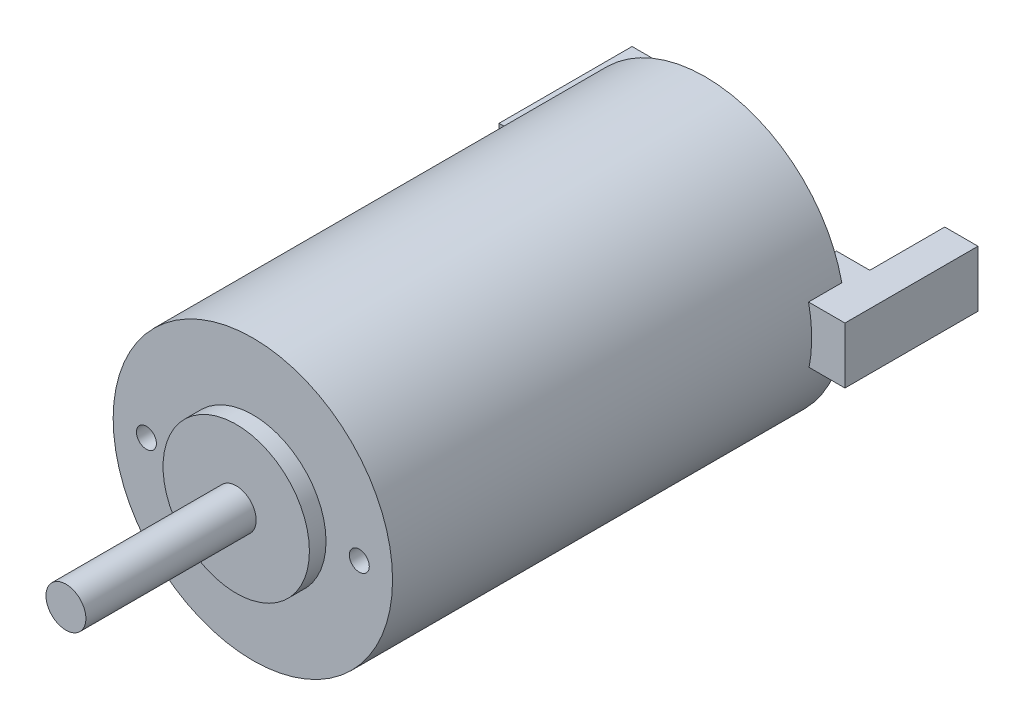
ISO-10303-21;
HEADER;
FILE_DESCRIPTION(('STEP AP214'),'2;1');
FILE_NAME('part.step','',(''),(''),'','','');
FILE_SCHEMA(('AUTOMOTIVE_DESIGN { 1 0 10303 214 1 1 1 1 }'));
ENDSEC;
DATA;
#1=APPLICATION_CONTEXT('core data for automotive mechanical design processes');
#2=APPLICATION_PROTOCOL_DEFINITION('international standard','automotive_design',2000,#1);
#3=PRODUCT_CONTEXT('',#1,'mechanical');
#4=PRODUCT('Part','Part','',(#3));
#5=PRODUCT_RELATED_PRODUCT_CATEGORY('part','',(#4));
#6=PRODUCT_DEFINITION_FORMATION('','',#4);
#7=PRODUCT_DEFINITION_CONTEXT('part definition',#1,'design');
#8=PRODUCT_DEFINITION('design','',#6,#7);
#9=PRODUCT_DEFINITION_SHAPE('','',#8);
#10=(LENGTH_UNIT() NAMED_UNIT(*) SI_UNIT(.MILLI.,.METRE.));
#11=(NAMED_UNIT(*) PLANE_ANGLE_UNIT() SI_UNIT($,.RADIAN.));
#12=(NAMED_UNIT(*) SI_UNIT($,.STERADIAN.) SOLID_ANGLE_UNIT());
#13=UNCERTAINTY_MEASURE_WITH_UNIT(LENGTH_MEASURE(1.E-05),#10,'distance_accuracy_value','');
#14=(GEOMETRIC_REPRESENTATION_CONTEXT(3) GLOBAL_UNCERTAINTY_ASSIGNED_CONTEXT((#13)) GLOBAL_UNIT_ASSIGNED_CONTEXT((#10,
#11,#12)) REPRESENTATION_CONTEXT('',''));
#15=CARTESIAN_POINT('',(0.,0.,0.));
#16=DIRECTION('',(0.,0.,1.));
#17=DIRECTION('',(1.,0.,0.));
#18=AXIS2_PLACEMENT_3D('',#15,#16,#17);
#19=CARTESIAN_POINT('',(0.,0.,68.));
#20=DIRECTION('',(0.,0.,-1.));
#21=DIRECTION('',(-1.,0.,0.));
#22=AXIS2_PLACEMENT_3D('',#19,#20,#21);
#23=CYLINDRICAL_SURFACE('',#22,21.);
#24=CARTESIAN_POINT('',(0.,0.,68.));
#25=DIRECTION('',(0.,0.,1.));
#26=DIRECTION('',(1.,0.,0.));
#27=AXIS2_PLACEMENT_3D('',#24,#25,#26);
#28=CIRCLE('',#27,21.);
#29=CARTESIAN_POINT('',(21.,0.,68.));
#30=VERTEX_POINT('',#29);
#31=EDGE_CURVE('E302',#30,#30,#28,.T.);
#32=ORIENTED_EDGE('',*,*,#31,.F.);
#33=EDGE_LOOP('',(#32));
#34=FACE_BOUND('',#33,.T.);
#35=DIRECTION('',(0.,0.,-1.));
#36=VECTOR('',#35,1.);
#37=CARTESIAN_POINT('',(-20.6096565623727,-4.03014346904024,68.));
#38=LINE('',#37,#36);
#39=CARTESIAN_POINT('',(-20.6096565623727,-4.03014346904024,0.));
#40=VERTEX_POINT('',#39);
#41=CARTESIAN_POINT('',(-20.6096565623727,-4.03014346904024,5.));
#42=VERTEX_POINT('',#41);
#43=EDGE_CURVE('E240',#40,#42,#38,.F.);
#44=ORIENTED_EDGE('',*,*,#43,.F.);
#45=CARTESIAN_POINT('',(0.,0.,0.));
#46=DIRECTION('',(0.,0.,1.));
#47=DIRECTION('',(1.,0.,0.));
#48=AXIS2_PLACEMENT_3D('',#45,#46,#47);
#49=CIRCLE('',#48,21.);
#50=CARTESIAN_POINT('',(20.6096565623727,-4.03014346904025,0.));
#51=VERTEX_POINT('',#50);
#52=EDGE_CURVE('E298',#40,#51,#49,.T.);
#53=ORIENTED_EDGE('',*,*,#52,.T.);
#54=DIRECTION('',(0.,0.,-1.));
#55=VECTOR('',#54,1.);
#56=CARTESIAN_POINT('',(20.6096565623727,-4.03014346904025,68.));
#57=LINE('',#56,#55);
#58=CARTESIAN_POINT('',(20.6096565623727,-4.03014346904025,5.));
#59=VERTEX_POINT('',#58);
#60=EDGE_CURVE('E277',#59,#51,#57,.T.);
#61=ORIENTED_EDGE('',*,*,#60,.F.);
#62=CARTESIAN_POINT('',(0.,0.,5.));
#63=DIRECTION('',(0.,0.,-1.));
#64=DIRECTION('',(-1.,0.,0.));
#65=AXIS2_PLACEMENT_3D('',#62,#63,#64);
#66=CIRCLE('',#65,21.);
#67=CARTESIAN_POINT('',(20.5258155301212,4.43744259945264,5.));
#68=VERTEX_POINT('',#67);
#69=EDGE_CURVE('E320',#68,#59,#66,.T.);
#70=ORIENTED_EDGE('',*,*,#69,.F.);
#71=DIRECTION('',(0.,0.,-1.));
#72=VECTOR('',#71,1.);
#73=CARTESIAN_POINT('',(20.5258155301212,4.43744259945264,68.));
#74=LINE('',#73,#72);
#75=CARTESIAN_POINT('',(20.5258155301212,4.43744259945264,0.));
#76=VERTEX_POINT('',#75);
#77=EDGE_CURVE('E281',#76,#68,#74,.F.);
#78=ORIENTED_EDGE('',*,*,#77,.F.);
#79=CARTESIAN_POINT('',(-20.5258155301212,4.43744259945264,0.));
#80=VERTEX_POINT('',#79);
#81=EDGE_CURVE('E306',#76,#80,#49,.T.);
#82=ORIENTED_EDGE('',*,*,#81,.T.);
#83=DIRECTION('',(0.,0.,-1.));
#84=VECTOR('',#83,1.);
#85=CARTESIAN_POINT('',(-20.5258155301212,4.43744259945264,68.));
#86=LINE('',#85,#84);
#87=CARTESIAN_POINT('',(-20.5258155301212,4.43744259945264,5.));
#88=VERTEX_POINT('',#87);
#89=EDGE_CURVE('E237',#88,#80,#86,.T.);
#90=ORIENTED_EDGE('',*,*,#89,.F.);
#91=CARTESIAN_POINT('',(0.,0.,5.));
#92=DIRECTION('',(0.,0.,-1.));
#93=DIRECTION('',(-1.,0.,0.));
#94=AXIS2_PLACEMENT_3D('',#91,#92,#93);
#95=CIRCLE('',#94,21.);
#96=EDGE_CURVE('E334',#42,#88,#95,.T.);
#97=ORIENTED_EDGE('',*,*,#96,.F.);
#98=EDGE_LOOP('',(#44,#53,#61,#70,#78,#82,#90,#97));
#99=FACE_BOUND('',#98,.T.);
#100=ADVANCED_FACE('F38',(#34,#99),#23,.T.);
#101=CARTESIAN_POINT('',(0.,0.,0.));
#102=DIRECTION('',(0.,0.,1.));
#103=DIRECTION('',(1.,0.,0.));
#104=AXIS2_PLACEMENT_3D('',#101,#102,#103);
#105=PLANE('',#104);
#106=DIRECTION('',(-1.,0.,0.));
#107=VECTOR('',#106,1.);
#108=CARTESIAN_POINT('',(0.,-4.03014346904024,0.));
#109=LINE('',#108,#107);
#110=CARTESIAN_POINT('',(-16.,-4.03014346904024,0.));
#111=VERTEX_POINT('',#110);
#112=EDGE_CURVE('E331',#111,#40,#109,.T.);
#113=ORIENTED_EDGE('',*,*,#112,.F.);
#114=DIRECTION('',(0.,1.,0.));
#115=VECTOR('',#114,1.);
#116=CARTESIAN_POINT('',(-16.,0.,0.));
#117=LINE('',#116,#115);
#118=CARTESIAN_POINT('',(-16.,4.43744259945264,0.));
#119=VERTEX_POINT('',#118);
#120=EDGE_CURVE('E323',#111,#119,#117,.T.);
#121=ORIENTED_EDGE('',*,*,#120,.T.);
#122=DIRECTION('',(1.,0.,0.));
#123=VECTOR('',#122,1.);
#124=CARTESIAN_POINT('',(0.,4.43744259945264,0.));
#125=LINE('',#124,#123);
#126=EDGE_CURVE('E327',#80,#119,#125,.T.);
#127=ORIENTED_EDGE('',*,*,#126,.F.);
#128=ORIENTED_EDGE('',*,*,#81,.F.);
#129=DIRECTION('',(1.,0.,0.));
#130=VECTOR('',#129,1.);
#131=CARTESIAN_POINT('',(0.,4.43744259945264,0.));
#132=LINE('',#131,#130);
#133=CARTESIAN_POINT('',(16.,4.43744259945264,0.));
#134=VERTEX_POINT('',#133);
#135=EDGE_CURVE('E317',#134,#76,#132,.T.);
#136=ORIENTED_EDGE('',*,*,#135,.F.);
#137=DIRECTION('',(0.,-1.,0.));
#138=VECTOR('',#137,1.);
#139=CARTESIAN_POINT('',(16.,0.,0.));
#140=LINE('',#139,#138);
#141=CARTESIAN_POINT('',(16.,-4.03014346904025,0.));
#142=VERTEX_POINT('',#141);
#143=EDGE_CURVE('E293',#134,#142,#140,.T.);
#144=ORIENTED_EDGE('',*,*,#143,.T.);
#145=DIRECTION('',(-1.,0.,0.));
#146=VECTOR('',#145,1.);
#147=CARTESIAN_POINT('',(0.,-4.03014346904025,0.));
#148=LINE('',#147,#146);
#149=EDGE_CURVE('E313',#51,#142,#148,.T.);
#150=ORIENTED_EDGE('',*,*,#149,.F.);
#151=ORIENTED_EDGE('',*,*,#52,.F.);
#152=EDGE_LOOP('',(#113,#121,#127,#128,#136,#144,#150,#151));
#153=FACE_BOUND('',#152,.T.);
#154=ADVANCED_FACE('F367',(#153),#105,.F.);
#155=CARTESIAN_POINT('',(0.,0.,68.));
#156=DIRECTION('',(0.,0.,1.));
#157=DIRECTION('',(1.,0.,0.));
#158=AXIS2_PLACEMENT_3D('',#155,#156,#157);
#159=PLANE('',#158);
#160=CARTESIAN_POINT('',(-16.,0.,68.));
#161=DIRECTION('',(0.,0.,1.));
#162=DIRECTION('',(1.,0.,0.));
#163=AXIS2_PLACEMENT_3D('',#160,#161,#162);
#164=CIRCLE('',#163,1.5);
#165=CARTESIAN_POINT('',(-14.5,0.,68.));
#166=VERTEX_POINT('',#165);
#167=EDGE_CURVE('E486',#166,#166,#164,.T.);
#168=ORIENTED_EDGE('',*,*,#167,.F.);
#169=EDGE_LOOP('',(#168));
#170=FACE_BOUND('',#169,.T.);
#171=CARTESIAN_POINT('',(16.,0.,68.));
#172=DIRECTION('',(0.,0.,1.));
#173=DIRECTION('',(1.,0.,0.));
#174=AXIS2_PLACEMENT_3D('',#171,#172,#173);
#175=CIRCLE('',#174,1.5);
#176=CARTESIAN_POINT('',(17.5,0.,68.));
#177=VERTEX_POINT('',#176);
#178=EDGE_CURVE('E495',#177,#177,#175,.T.);
#179=ORIENTED_EDGE('',*,*,#178,.F.);
#180=EDGE_LOOP('',(#179));
#181=FACE_BOUND('',#180,.T.);
#182=CARTESIAN_POINT('',(0.,0.,68.));
#183=DIRECTION('',(0.,0.,1.));
#184=DIRECTION('',(1.,0.,0.));
#185=AXIS2_PLACEMENT_3D('',#182,#183,#184);
#186=CIRCLE('',#185,11.);
#187=CARTESIAN_POINT('',(11.,0.,68.));
#188=VERTEX_POINT('',#187);
#189=EDGE_CURVE('E294',#188,#188,#186,.T.);
#190=ORIENTED_EDGE('',*,*,#189,.F.);
#191=EDGE_LOOP('',(#190));
#192=FACE_BOUND('',#191,.T.);
#193=ORIENTED_EDGE('',*,*,#31,.T.);
#194=EDGE_LOOP('',(#193));
#195=FACE_BOUND('',#194,.T.);
#196=ADVANCED_FACE('F393',(#170,#181,#192,#195),#159,.T.);
#197=CARTESIAN_POINT('',(0.,0.,70.5));
#198=DIRECTION('',(0.,0.,-1.));
#199=DIRECTION('',(-1.,0.,0.));
#200=AXIS2_PLACEMENT_3D('',#197,#198,#199);
#201=CYLINDRICAL_SURFACE('',#200,11.);
#202=CARTESIAN_POINT('',(0.,0.,70.5));
#203=DIRECTION('',(0.,0.,1.));
#204=DIRECTION('',(1.,0.,0.));
#205=AXIS2_PLACEMENT_3D('',#202,#203,#204);
#206=CIRCLE('',#205,11.);
#207=CARTESIAN_POINT('',(11.,0.,70.5));
#208=VERTEX_POINT('',#207);
#209=EDGE_CURVE('E288',#208,#208,#206,.T.);
#210=ORIENTED_EDGE('',*,*,#209,.F.);
#211=EDGE_LOOP('',(#210));
#212=FACE_BOUND('',#211,.T.);
#213=ORIENTED_EDGE('',*,*,#189,.T.);
#214=EDGE_LOOP('',(#213));
#215=FACE_BOUND('',#214,.T.);
#216=ADVANCED_FACE('F397',(#212,#215),#201,.T.);
#217=CARTESIAN_POINT('',(0.,0.,70.5));
#218=DIRECTION('',(0.,0.,1.));
#219=DIRECTION('',(1.,0.,0.));
#220=AXIS2_PLACEMENT_3D('',#217,#218,#219);
#221=PLANE('',#220);
#222=CARTESIAN_POINT('',(0.,0.,70.5));
#223=DIRECTION('',(0.,0.,1.));
#224=DIRECTION('',(1.,0.,0.));
#225=AXIS2_PLACEMENT_3D('',#222,#223,#224);
#226=CIRCLE('',#225,3.);
#227=CARTESIAN_POINT('',(3.,0.,70.5));
#228=VERTEX_POINT('',#227);
#229=EDGE_CURVE('E289',#228,#228,#226,.T.);
#230=ORIENTED_EDGE('',*,*,#229,.F.);
#231=EDGE_LOOP('',(#230));
#232=FACE_BOUND('',#231,.T.);
#233=ORIENTED_EDGE('',*,*,#209,.T.);
#234=EDGE_LOOP('',(#233));
#235=FACE_BOUND('',#234,.T.);
#236=ADVANCED_FACE('F405',(#232,#235),#221,.T.);
#237=CARTESIAN_POINT('',(0.,0.,96.1));
#238=DIRECTION('',(0.,0.,-1.));
#239=DIRECTION('',(-1.,0.,0.));
#240=AXIS2_PLACEMENT_3D('',#237,#238,#239);
#241=CYLINDRICAL_SURFACE('',#240,3.);
#242=CARTESIAN_POINT('',(0.,0.,96.1));
#243=DIRECTION('',(0.,0.,1.));
#244=DIRECTION('',(1.,0.,0.));
#245=AXIS2_PLACEMENT_3D('',#242,#243,#244);
#246=CIRCLE('',#245,3.);
#247=CARTESIAN_POINT('',(3.,0.,96.1));
#248=VERTEX_POINT('',#247);
#249=EDGE_CURVE('E284',#248,#248,#246,.T.);
#250=ORIENTED_EDGE('',*,*,#249,.F.);
#251=EDGE_LOOP('',(#250));
#252=FACE_BOUND('',#251,.T.);
#253=ORIENTED_EDGE('',*,*,#229,.T.);
#254=EDGE_LOOP('',(#253));
#255=FACE_BOUND('',#254,.T.);
#256=ADVANCED_FACE('F413',(#252,#255),#241,.T.);
#257=CARTESIAN_POINT('',(0.,0.,96.1));
#258=DIRECTION('',(0.,0.,1.));
#259=DIRECTION('',(1.,0.,0.));
#260=AXIS2_PLACEMENT_3D('',#257,#258,#259);
#261=PLANE('',#260);
#262=ORIENTED_EDGE('',*,*,#249,.T.);
#263=EDGE_LOOP('',(#262));
#264=FACE_BOUND('',#263,.T.);
#265=ADVANCED_FACE('F417',(#264),#261,.T.);
#266=CARTESIAN_POINT('',(26.,4.43744259945264,5.));
#267=DIRECTION('',(0.,-1.,0.));
#268=DIRECTION('',(0.,0.,-1.));
#269=AXIS2_PLACEMENT_3D('',#266,#267,#268);
#270=PLANE('',#269);
#271=DIRECTION('',(-1.,0.,0.));
#272=VECTOR('',#271,1.);
#273=CARTESIAN_POINT('',(26.,4.43744259945264,-15.));
#274=LINE('',#273,#272);
#275=CARTESIAN_POINT('',(26.,4.43744259945264,-15.));
#276=VERTEX_POINT('',#275);
#277=CARTESIAN_POINT('',(21.,4.43744259945264,-15.));
#278=VERTEX_POINT('',#277);
#279=EDGE_CURVE('E175',#276,#278,#274,.T.);
#280=ORIENTED_EDGE('',*,*,#279,.T.);
#281=DIRECTION('',(0.,0.,-1.));
#282=VECTOR('',#281,1.);
#283=CARTESIAN_POINT('',(21.,4.43744259945264,-3.73500225310474));
#284=LINE('',#283,#282);
#285=CARTESIAN_POINT('',(21.,4.43744259945264,-3.73500225310474));
#286=VERTEX_POINT('',#285);
#287=EDGE_CURVE('E53',#286,#278,#284,.T.);
#288=ORIENTED_EDGE('',*,*,#287,.F.);
#289=DIRECTION('',(1.,0.,0.));
#290=VECTOR('',#289,1.);
#291=CARTESIAN_POINT('',(16.,4.43744259945264,-3.73500225310474));
#292=LINE('',#291,#290);
#293=CARTESIAN_POINT('',(16.,4.43744259945264,-3.73500225310474));
#294=VERTEX_POINT('',#293);
#295=EDGE_CURVE('E161',#294,#286,#292,.T.);
#296=ORIENTED_EDGE('',*,*,#295,.F.);
#297=DIRECTION('',(0.,0.,1.));
#298=VECTOR('',#297,1.);
#299=CARTESIAN_POINT('',(16.,4.43744259945264,5.));
#300=LINE('',#299,#298);
#301=EDGE_CURVE('E243',#294,#134,#300,.T.);
#302=ORIENTED_EDGE('',*,*,#301,.T.);
#303=ORIENTED_EDGE('',*,*,#135,.T.);
#304=ORIENTED_EDGE('',*,*,#77,.T.);
#305=DIRECTION('',(-1.,0.,0.));
#306=VECTOR('',#305,1.);
#307=CARTESIAN_POINT('',(26.,4.43744259945264,5.));
#308=LINE('',#307,#306);
#309=CARTESIAN_POINT('',(26.,4.43744259945264,5.));
#310=VERTEX_POINT('',#309);
#311=EDGE_CURVE('E273',#310,#68,#308,.T.);
#312=ORIENTED_EDGE('',*,*,#311,.F.);
#313=DIRECTION('',(0.,0.,1.));
#314=VECTOR('',#313,1.);
#315=CARTESIAN_POINT('',(26.,4.43744259945264,5.));
#316=LINE('',#315,#314);
#317=EDGE_CURVE('E244',#276,#310,#316,.T.);
#318=ORIENTED_EDGE('',*,*,#317,.F.);
#319=EDGE_LOOP('',(#280,#288,#296,#302,#303,#304,#312,#318));
#320=FACE_BOUND('',#319,.T.);
#321=ADVANCED_FACE('F172',(#320),#270,.F.);
#322=CARTESIAN_POINT('',(26.,-4.03014346904024,-15.));
#323=DIRECTION('',(0.,1.,0.));
#324=DIRECTION('',(0.,0.,1.));
#325=AXIS2_PLACEMENT_3D('',#322,#323,#324);
#326=PLANE('',#325);
#327=DIRECTION('',(1.,0.,0.));
#328=VECTOR('',#327,1.);
#329=CARTESIAN_POINT('',(26.,-4.03014346904025,-3.73500225310474));
#330=LINE('',#329,#328);
#331=CARTESIAN_POINT('',(16.,-4.03014346904025,-3.73500225310474));
#332=VERTEX_POINT('',#331);
#333=CARTESIAN_POINT('',(21.,-4.03014346904025,-3.73500225310474));
#334=VERTEX_POINT('',#333);
#335=EDGE_CURVE('E197',#332,#334,#330,.T.);
#336=ORIENTED_EDGE('',*,*,#335,.T.);
#337=DIRECTION('',(0.,0.,-1.));
#338=VECTOR('',#337,1.);
#339=CARTESIAN_POINT('',(21.,-4.03014346904024,-15.));
#340=LINE('',#339,#338);
#341=CARTESIAN_POINT('',(21.,-4.03014346904024,-15.));
#342=VERTEX_POINT('',#341);
#343=EDGE_CURVE('E153',#334,#342,#340,.T.);
#344=ORIENTED_EDGE('',*,*,#343,.T.);
#345=DIRECTION('',(-1.,0.,0.));
#346=VECTOR('',#345,1.);
#347=CARTESIAN_POINT('',(26.,-4.03014346904024,-15.));
#348=LINE('',#347,#346);
#349=CARTESIAN_POINT('',(26.,-4.03014346904024,-15.));
#350=VERTEX_POINT('',#349);
#351=EDGE_CURVE('E265',#350,#342,#348,.T.);
#352=ORIENTED_EDGE('',*,*,#351,.F.);
#353=DIRECTION('',(0.,0.,-1.));
#354=VECTOR('',#353,1.);
#355=CARTESIAN_POINT('',(26.,-4.03014346904024,-15.));
#356=LINE('',#355,#354);
#357=CARTESIAN_POINT('',(26.,-4.03014346904025,5.));
#358=VERTEX_POINT('',#357);
#359=EDGE_CURVE('E252',#358,#350,#356,.T.);
#360=ORIENTED_EDGE('',*,*,#359,.F.);
#361=DIRECTION('',(-1.,0.,0.));
#362=VECTOR('',#361,1.);
#363=CARTESIAN_POINT('',(26.,-4.03014346904025,5.));
#364=LINE('',#363,#362);
#365=EDGE_CURVE('E269',#358,#59,#364,.T.);
#366=ORIENTED_EDGE('',*,*,#365,.T.);
#367=ORIENTED_EDGE('',*,*,#60,.T.);
#368=ORIENTED_EDGE('',*,*,#149,.T.);
#369=DIRECTION('',(0.,0.,-1.));
#370=VECTOR('',#369,1.);
#371=CARTESIAN_POINT('',(16.,-4.03014346904024,-15.));
#372=LINE('',#371,#370);
#373=EDGE_CURVE('E249',#142,#332,#372,.T.);
#374=ORIENTED_EDGE('',*,*,#373,.T.);
#375=EDGE_LOOP('',(#336,#344,#352,#360,#366,#367,#368,#374));
#376=FACE_BOUND('',#375,.T.);
#377=ADVANCED_FACE('F424',(#376),#326,.F.);
#378=CARTESIAN_POINT('',(16.,0.,0.));
#379=DIRECTION('',(-1.,0.,0.));
#380=DIRECTION('',(0.,0.,1.));
#381=AXIS2_PLACEMENT_3D('',#378,#379,#380);
#382=PLANE('',#381);
#383=DIRECTION('',(0.,1.,0.));
#384=VECTOR('',#383,1.);
#385=CARTESIAN_POINT('',(16.,0.,-3.73500225310474));
#386=LINE('',#385,#384);
#387=EDGE_CURVE('E164',#332,#294,#386,.T.);
#388=ORIENTED_EDGE('',*,*,#387,.F.);
#389=ORIENTED_EDGE('',*,*,#373,.F.);
#390=ORIENTED_EDGE('',*,*,#143,.F.);
#391=ORIENTED_EDGE('',*,*,#301,.F.);
#392=EDGE_LOOP('',(#388,#389,#390,#391));
#393=FACE_BOUND('',#392,.T.);
#394=ADVANCED_FACE('F429',(#393),#382,.T.);
#395=CARTESIAN_POINT('',(26.,-4.03014346904025,5.));
#396=DIRECTION('',(0.,0.,-1.));
#397=DIRECTION('',(-1.,0.,0.));
#398=AXIS2_PLACEMENT_3D('',#395,#396,#397);
#399=PLANE('',#398);
#400=ORIENTED_EDGE('',*,*,#311,.T.);
#401=ORIENTED_EDGE('',*,*,#69,.T.);
#402=ORIENTED_EDGE('',*,*,#365,.F.);
#403=DIRECTION('',(0.,-1.,0.));
#404=VECTOR('',#403,1.);
#405=CARTESIAN_POINT('',(26.,-4.03014346904025,5.));
#406=LINE('',#405,#404);
#407=EDGE_CURVE('E248',#310,#358,#406,.T.);
#408=ORIENTED_EDGE('',*,*,#407,.F.);
#409=EDGE_LOOP('',(#400,#401,#402,#408));
#410=FACE_BOUND('',#409,.T.);
#411=ADVANCED_FACE('F425',(#410),#399,.F.);
#412=CARTESIAN_POINT('',(26.,4.43744259945264,-15.));
#413=DIRECTION('',(0.,0.,1.));
#414=DIRECTION('',(1.,0.,0.));
#415=AXIS2_PLACEMENT_3D('',#412,#413,#414);
#416=PLANE('',#415);
#417=ORIENTED_EDGE('',*,*,#351,.T.);
#418=DIRECTION('',(0.,1.,0.));
#419=VECTOR('',#418,1.);
#420=CARTESIAN_POINT('',(21.,-21.,-15.));
#421=LINE('',#420,#419);
#422=EDGE_CURVE('E157',#342,#278,#421,.T.);
#423=ORIENTED_EDGE('',*,*,#422,.T.);
#424=ORIENTED_EDGE('',*,*,#279,.F.);
#425=DIRECTION('',(0.,1.,0.));
#426=VECTOR('',#425,1.);
#427=CARTESIAN_POINT('',(26.,4.43744259945264,-15.));
#428=LINE('',#427,#426);
#429=EDGE_CURVE('E255',#350,#276,#428,.T.);
#430=ORIENTED_EDGE('',*,*,#429,.F.);
#431=EDGE_LOOP('',(#417,#423,#424,#430));
#432=FACE_BOUND('',#431,.T.);
#433=ADVANCED_FACE('F428',(#432),#416,.F.);
#434=CARTESIAN_POINT('',(26.,0.,0.));
#435=DIRECTION('',(-1.,0.,0.));
#436=DIRECTION('',(0.,0.,1.));
#437=AXIS2_PLACEMENT_3D('',#434,#435,#436);
#438=PLANE('',#437);
#439=ORIENTED_EDGE('',*,*,#317,.T.);
#440=ORIENTED_EDGE('',*,*,#407,.T.);
#441=ORIENTED_EDGE('',*,*,#359,.T.);
#442=ORIENTED_EDGE('',*,*,#429,.T.);
#443=EDGE_LOOP('',(#439,#440,#441,#442));
#444=FACE_BOUND('',#443,.T.);
#445=ADVANCED_FACE('F436',(#444),#438,.F.);
#446=CARTESIAN_POINT('',(-16.,-4.03014346904024,5.));
#447=DIRECTION('',(0.,1.,0.));
#448=DIRECTION('',(0.,0.,1.));
#449=AXIS2_PLACEMENT_3D('',#446,#447,#448);
#450=PLANE('',#449);
#451=DIRECTION('',(-1.,0.,0.));
#452=VECTOR('',#451,1.);
#453=CARTESIAN_POINT('',(-16.,-4.03014346904024,-15.));
#454=LINE('',#453,#452);
#455=CARTESIAN_POINT('',(-21.,-4.03014346904024,-15.));
#456=VERTEX_POINT('',#455);
#457=CARTESIAN_POINT('',(-26.,-4.03014346904024,-15.));
#458=VERTEX_POINT('',#457);
#459=EDGE_CURVE('E231',#456,#458,#454,.T.);
#460=ORIENTED_EDGE('',*,*,#459,.F.);
#461=DIRECTION('',(0.,0.,1.));
#462=VECTOR('',#461,1.);
#463=CARTESIAN_POINT('',(-21.,-4.03014346904024,5.));
#464=LINE('',#463,#462);
#465=CARTESIAN_POINT('',(-21.,-4.03014346904024,-3.73500225310474));
#466=VERTEX_POINT('',#465);
#467=EDGE_CURVE('E61',#456,#466,#464,.T.);
#468=ORIENTED_EDGE('',*,*,#467,.T.);
#469=DIRECTION('',(1.,0.,0.));
#470=VECTOR('',#469,1.);
#471=CARTESIAN_POINT('',(-16.,-4.03014346904024,-3.73500225310474));
#472=LINE('',#471,#470);
#473=CARTESIAN_POINT('',(-16.,-4.03014346904024,-3.73500225310474));
#474=VERTEX_POINT('',#473);
#475=EDGE_CURVE('E191',#466,#474,#472,.T.);
#476=ORIENTED_EDGE('',*,*,#475,.T.);
#477=DIRECTION('',(0.,0.,-1.));
#478=VECTOR('',#477,1.);
#479=CARTESIAN_POINT('',(-16.,-4.03014346904024,5.));
#480=LINE('',#479,#478);
#481=EDGE_CURVE('E203',#111,#474,#480,.T.);
#482=ORIENTED_EDGE('',*,*,#481,.F.);
#483=ORIENTED_EDGE('',*,*,#112,.T.);
#484=ORIENTED_EDGE('',*,*,#43,.T.);
#485=DIRECTION('',(-1.,0.,0.));
#486=VECTOR('',#485,1.);
#487=CARTESIAN_POINT('',(-16.,-4.03014346904024,5.));
#488=LINE('',#487,#486);
#489=CARTESIAN_POINT('',(-26.,-4.03014346904024,5.));
#490=VERTEX_POINT('',#489);
#491=EDGE_CURVE('E234',#42,#490,#488,.T.);
#492=ORIENTED_EDGE('',*,*,#491,.T.);
#493=DIRECTION('',(0.,0.,-1.));
#494=VECTOR('',#493,1.);
#495=CARTESIAN_POINT('',(-26.,-4.03014346904024,5.));
#496=LINE('',#495,#494);
#497=EDGE_CURVE('E215',#490,#458,#496,.T.);
#498=ORIENTED_EDGE('',*,*,#497,.T.);
#499=EDGE_LOOP('',(#460,#468,#476,#482,#483,#484,#492,#498));
#500=FACE_BOUND('',#499,.T.);
#501=ADVANCED_FACE('F343',(#500),#450,.F.);
#502=CARTESIAN_POINT('',(-16.,4.43744259945264,5.));
#503=DIRECTION('',(0.,-1.,0.));
#504=DIRECTION('',(0.,0.,-1.));
#505=AXIS2_PLACEMENT_3D('',#502,#503,#504);
#506=PLANE('',#505);
#507=CARTESIAN_POINT('',(-21.,4.43744259945264,-3.73500225310474));
#508=VERTEX_POINT('',#507);
#509=CARTESIAN_POINT('',(-16.,4.43744259945264,-3.73500225310474));
#510=VERTEX_POINT('',#509);
#511=EDGE_CURVE('E168',#508,#510,#292,.T.);
#512=ORIENTED_EDGE('',*,*,#511,.F.);
#513=DIRECTION('',(0.,0.,1.));
#514=VECTOR('',#513,1.);
#515=CARTESIAN_POINT('',(-21.,4.43744259945264,-15.));
#516=LINE('',#515,#514);
#517=CARTESIAN_POINT('',(-21.,4.43744259945264,-15.));
#518=VERTEX_POINT('',#517);
#519=EDGE_CURVE('E158',#518,#508,#516,.T.);
#520=ORIENTED_EDGE('',*,*,#519,.F.);
#521=DIRECTION('',(-1.,0.,0.));
#522=VECTOR('',#521,1.);
#523=CARTESIAN_POINT('',(-16.,4.43744259945264,-15.));
#524=LINE('',#523,#522);
#525=CARTESIAN_POINT('',(-26.,4.43744259945264,-15.));
#526=VERTEX_POINT('',#525);
#527=EDGE_CURVE('E228',#518,#526,#524,.T.);
#528=ORIENTED_EDGE('',*,*,#527,.T.);
#529=DIRECTION('',(0.,0.,1.));
#530=VECTOR('',#529,1.);
#531=CARTESIAN_POINT('',(-26.,4.43744259945264,5.));
#532=LINE('',#531,#530);
#533=CARTESIAN_POINT('',(-26.,4.43744259945264,5.));
#534=VERTEX_POINT('',#533);
#535=EDGE_CURVE('E208',#526,#534,#532,.T.);
#536=ORIENTED_EDGE('',*,*,#535,.T.);
#537=DIRECTION('',(-1.,0.,0.));
#538=VECTOR('',#537,1.);
#539=CARTESIAN_POINT('',(-16.,4.43744259945264,5.));
#540=LINE('',#539,#538);
#541=EDGE_CURVE('E211',#88,#534,#540,.T.);
#542=ORIENTED_EDGE('',*,*,#541,.F.);
#543=ORIENTED_EDGE('',*,*,#89,.T.);
#544=ORIENTED_EDGE('',*,*,#126,.T.);
#545=DIRECTION('',(0.,0.,1.));
#546=VECTOR('',#545,1.);
#547=CARTESIAN_POINT('',(-16.,4.43744259945264,5.));
#548=LINE('',#547,#546);
#549=EDGE_CURVE('E207',#510,#119,#548,.T.);
#550=ORIENTED_EDGE('',*,*,#549,.F.);
#551=EDGE_LOOP('',(#512,#520,#528,#536,#542,#543,#544,#550));
#552=FACE_BOUND('',#551,.T.);
#553=ADVANCED_FACE('F354',(#552),#506,.F.);
#554=CARTESIAN_POINT('',(-16.,0.,0.));
#555=DIRECTION('',(1.,0.,0.));
#556=DIRECTION('',(0.,0.,-1.));
#557=AXIS2_PLACEMENT_3D('',#554,#555,#556);
#558=PLANE('',#557);
#559=DIRECTION('',(0.,-1.,0.));
#560=VECTOR('',#559,1.);
#561=CARTESIAN_POINT('',(-16.,0.,-3.73500225310474));
#562=LINE('',#561,#560);
#563=EDGE_CURVE('E11',#510,#474,#562,.T.);
#564=ORIENTED_EDGE('',*,*,#563,.F.);
#565=ORIENTED_EDGE('',*,*,#549,.T.);
#566=ORIENTED_EDGE('',*,*,#120,.F.);
#567=ORIENTED_EDGE('',*,*,#481,.T.);
#568=EDGE_LOOP('',(#564,#565,#566,#567));
#569=FACE_BOUND('',#568,.T.);
#570=ADVANCED_FACE('F364',(#569),#558,.T.);
#571=CARTESIAN_POINT('',(-16.,4.43744259945264,5.));
#572=DIRECTION('',(0.,0.,-1.));
#573=DIRECTION('',(-1.,0.,0.));
#574=AXIS2_PLACEMENT_3D('',#571,#572,#573);
#575=PLANE('',#574);
#576=ORIENTED_EDGE('',*,*,#491,.F.);
#577=ORIENTED_EDGE('',*,*,#96,.T.);
#578=ORIENTED_EDGE('',*,*,#541,.T.);
#579=DIRECTION('',(0.,-1.,0.));
#580=VECTOR('',#579,1.);
#581=CARTESIAN_POINT('',(-26.,4.43744259945264,5.));
#582=LINE('',#581,#580);
#583=EDGE_CURVE('E202',#534,#490,#582,.T.);
#584=ORIENTED_EDGE('',*,*,#583,.T.);
#585=EDGE_LOOP('',(#576,#577,#578,#584));
#586=FACE_BOUND('',#585,.T.);
#587=ADVANCED_FACE('F376',(#586),#575,.F.);
#588=CARTESIAN_POINT('',(-16.,4.43744259945264,-15.));
#589=DIRECTION('',(0.,0.,1.));
#590=DIRECTION('',(1.,0.,0.));
#591=AXIS2_PLACEMENT_3D('',#588,#589,#590);
#592=PLANE('',#591);
#593=ORIENTED_EDGE('',*,*,#527,.F.);
#594=DIRECTION('',(0.,-1.,0.));
#595=VECTOR('',#594,1.);
#596=CARTESIAN_POINT('',(-21.,4.43744259945264,-15.));
#597=LINE('',#596,#595);
#598=EDGE_CURVE('E46',#518,#456,#597,.T.);
#599=ORIENTED_EDGE('',*,*,#598,.T.);
#600=ORIENTED_EDGE('',*,*,#459,.T.);
#601=DIRECTION('',(0.,1.,0.));
#602=VECTOR('',#601,1.);
#603=CARTESIAN_POINT('',(-26.,4.43744259945264,-15.));
#604=LINE('',#603,#602);
#605=EDGE_CURVE('E219',#458,#526,#604,.T.);
#606=ORIENTED_EDGE('',*,*,#605,.T.);
#607=EDGE_LOOP('',(#593,#599,#600,#606));
#608=FACE_BOUND('',#607,.T.);
#609=ADVANCED_FACE('F340',(#608),#592,.F.);
#610=CARTESIAN_POINT('',(-26.,0.,0.));
#611=DIRECTION('',(1.,0.,0.));
#612=DIRECTION('',(0.,0.,-1.));
#613=AXIS2_PLACEMENT_3D('',#610,#611,#612);
#614=PLANE('',#613);
#615=ORIENTED_EDGE('',*,*,#583,.F.);
#616=ORIENTED_EDGE('',*,*,#535,.F.);
#617=ORIENTED_EDGE('',*,*,#605,.F.);
#618=ORIENTED_EDGE('',*,*,#497,.F.);
#619=EDGE_LOOP('',(#615,#616,#617,#618));
#620=FACE_BOUND('',#619,.T.);
#621=ADVANCED_FACE('F350',(#620),#614,.F.);
#622=CARTESIAN_POINT('',(-21.,-21.,-15.));
#623=DIRECTION('',(-1.,0.,0.));
#624=DIRECTION('',(0.,0.,1.));
#625=AXIS2_PLACEMENT_3D('',#622,#623,#624);
#626=PLANE('',#625);
#627=ORIENTED_EDGE('',*,*,#598,.F.);
#628=ORIENTED_EDGE('',*,*,#519,.T.);
#629=DIRECTION('',(0.,1.,0.));
#630=VECTOR('',#629,1.);
#631=CARTESIAN_POINT('',(-21.,-21.,-3.73500225310474));
#632=LINE('',#631,#630);
#633=EDGE_CURVE('E184',#466,#508,#632,.T.);
#634=ORIENTED_EDGE('',*,*,#633,.F.);
#635=ORIENTED_EDGE('',*,*,#467,.F.);
#636=EDGE_LOOP('',(#627,#628,#634,#635));
#637=FACE_BOUND('',#636,.T.);
#638=ADVANCED_FACE('F357',(#637),#626,.F.);
#639=CARTESIAN_POINT('',(16.,-21.,-3.73500225310474));
#640=DIRECTION('',(0.,0.,1.));
#641=DIRECTION('',(1.,0.,0.));
#642=AXIS2_PLACEMENT_3D('',#639,#640,#641);
#643=PLANE('',#642);
#644=ORIENTED_EDGE('',*,*,#633,.T.);
#645=ORIENTED_EDGE('',*,*,#511,.T.);
#646=ORIENTED_EDGE('',*,*,#563,.T.);
#647=ORIENTED_EDGE('',*,*,#475,.F.);
#648=EDGE_LOOP('',(#644,#645,#646,#647));
#649=FACE_BOUND('',#648,.T.);
#650=ADVANCED_FACE('F359',(#649),#643,.F.);
#651=CARTESIAN_POINT('',(21.,-21.,-3.73500225310474));
#652=DIRECTION('',(1.,0.,0.));
#653=DIRECTION('',(0.,0.,-1.));
#654=AXIS2_PLACEMENT_3D('',#651,#652,#653);
#655=PLANE('',#654);
#656=DIRECTION('',(0.,1.,0.));
#657=VECTOR('',#656,1.);
#658=CARTESIAN_POINT('',(21.,-21.,-3.73500225310474));
#659=LINE('',#658,#657);
#660=EDGE_CURVE('E149',#334,#286,#659,.T.);
#661=ORIENTED_EDGE('',*,*,#660,.T.);
#662=ORIENTED_EDGE('',*,*,#287,.T.);
#663=ORIENTED_EDGE('',*,*,#422,.F.);
#664=ORIENTED_EDGE('',*,*,#343,.F.);
#665=EDGE_LOOP('',(#661,#662,#663,#664));
#666=FACE_BOUND('',#665,.T.);
#667=ADVANCED_FACE('F151',(#666),#655,.F.);
#668=ORIENTED_EDGE('',*,*,#387,.T.);
#669=ORIENTED_EDGE('',*,*,#295,.T.);
#670=ORIENTED_EDGE('',*,*,#660,.F.);
#671=ORIENTED_EDGE('',*,*,#335,.F.);
#672=EDGE_LOOP('',(#668,#669,#670,#671));
#673=FACE_BOUND('',#672,.T.);
#674=ADVANCED_FACE('F162',(#673),#643,.F.);
#675=CARTESIAN_POINT('',(16.,0.,58.));
#676=DIRECTION('',(0.,0.,1.));
#677=DIRECTION('',(1.,0.,0.));
#678=AXIS2_PLACEMENT_3D('',#675,#676,#677);
#679=CYLINDRICAL_SURFACE('',#678,1.5);
#680=CARTESIAN_POINT('',(16.,0.,58.));
#681=DIRECTION('',(0.,0.,1.));
#682=DIRECTION('',(1.,0.,0.));
#683=AXIS2_PLACEMENT_3D('',#680,#681,#682);
#684=CIRCLE('',#683,1.5);
#685=CARTESIAN_POINT('',(17.5,0.,58.));
#686=VERTEX_POINT('',#685);
#687=EDGE_CURVE('E490',#686,#686,#684,.T.);
#688=ORIENTED_EDGE('',*,*,#687,.F.);
#689=EDGE_LOOP('',(#688));
#690=FACE_BOUND('',#689,.T.);
#691=ORIENTED_EDGE('',*,*,#178,.T.);
#692=EDGE_LOOP('',(#691));
#693=FACE_BOUND('',#692,.T.);
#694=ADVANCED_FACE('F462',(#690,#693),#679,.F.);
#695=CARTESIAN_POINT('',(16.,0.,58.));
#696=DIRECTION('',(0.,0.,1.));
#697=DIRECTION('',(1.,0.,0.));
#698=AXIS2_PLACEMENT_3D('',#695,#696,#697);
#699=PLANE('',#698);
#700=ORIENTED_EDGE('',*,*,#687,.T.);
#701=EDGE_LOOP('',(#700));
#702=FACE_BOUND('',#701,.T.);
#703=ADVANCED_FACE('F469',(#702),#699,.T.);
#704=CARTESIAN_POINT('',(-16.,0.,58.));
#705=DIRECTION('',(0.,0.,1.));
#706=DIRECTION('',(1.,0.,0.));
#707=AXIS2_PLACEMENT_3D('',#704,#705,#706);
#708=CYLINDRICAL_SURFACE('',#707,1.5);
#709=CARTESIAN_POINT('',(-16.,0.,58.));
#710=DIRECTION('',(0.,0.,1.));
#711=DIRECTION('',(1.,0.,0.));
#712=AXIS2_PLACEMENT_3D('',#709,#710,#711);
#713=CIRCLE('',#712,1.5);
#714=CARTESIAN_POINT('',(-14.5,0.,58.));
#715=VERTEX_POINT('',#714);
#716=EDGE_CURVE('E169',#715,#715,#713,.T.);
#717=ORIENTED_EDGE('',*,*,#716,.F.);
#718=EDGE_LOOP('',(#717));
#719=FACE_BOUND('',#718,.T.);
#720=ORIENTED_EDGE('',*,*,#167,.T.);
#721=EDGE_LOOP('',(#720));
#722=FACE_BOUND('',#721,.T.);
#723=ADVANCED_FACE('F473',(#719,#722),#708,.F.);
#724=CARTESIAN_POINT('',(-16.,0.,58.));
#725=DIRECTION('',(0.,0.,1.));
#726=DIRECTION('',(1.,0.,0.));
#727=AXIS2_PLACEMENT_3D('',#724,#725,#726);
#728=PLANE('',#727);
#729=ORIENTED_EDGE('',*,*,#716,.T.);
#730=EDGE_LOOP('',(#729));
#731=FACE_BOUND('',#730,.T.);
#732=ADVANCED_FACE('F477',(#731),#728,.T.);
#733=CLOSED_SHELL('',(#100,#154,#196,#216,#236,#256,#265,#321,#377,#394,#411,#433,#445,#501,
#553,#570,#587,#609,#621,#638,#650,#667,#674,#694,#703,#723,#732));
#734=MANIFOLD_SOLID_BREP('B2',#733);
#735=ADVANCED_BREP_SHAPE_REPRESENTATION('',(#18,#734),#14);
#736=SHAPE_DEFINITION_REPRESENTATION(#9,#735);
ENDSEC;
END-ISO-10303-21;
